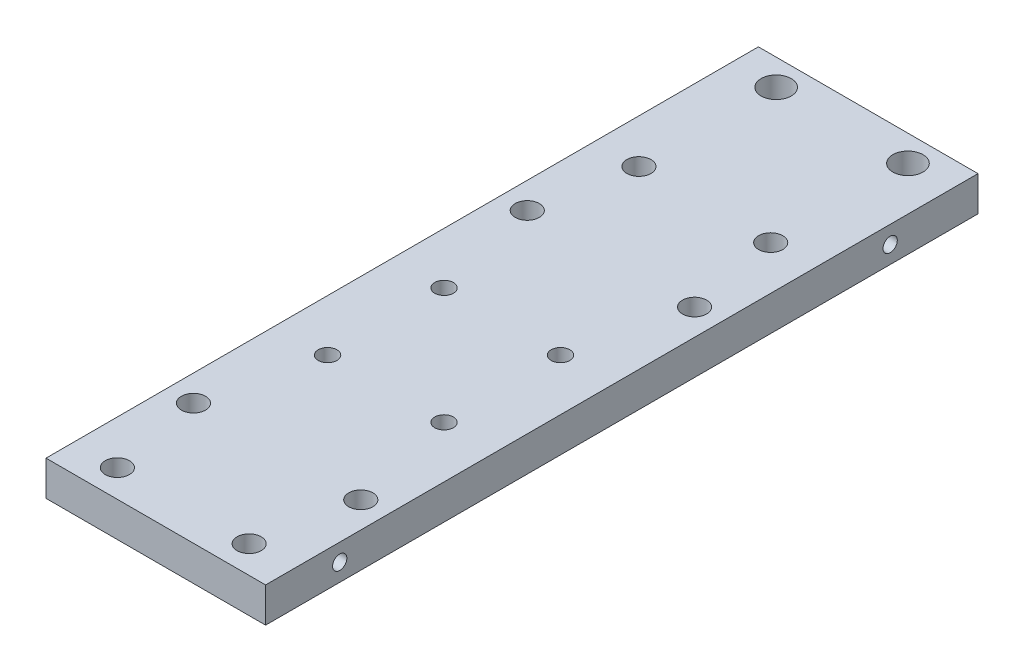
ISO-10303-21;
HEADER;
FILE_DESCRIPTION(('STEP AP214'),'2;1');
FILE_NAME('part.step','',(''),(''),'','','');
FILE_SCHEMA(('AUTOMOTIVE_DESIGN { 1 0 10303 214 1 1 1 1 }'));
ENDSEC;
DATA;
#1=APPLICATION_CONTEXT('core data for automotive mechanical design processes');
#2=APPLICATION_PROTOCOL_DEFINITION('international standard','automotive_design',2000,#1);
#3=PRODUCT_CONTEXT('',#1,'mechanical');
#4=PRODUCT('Part','Part','',(#3));
#5=PRODUCT_RELATED_PRODUCT_CATEGORY('part','',(#4));
#6=PRODUCT_DEFINITION_FORMATION('','',#4);
#7=PRODUCT_DEFINITION_CONTEXT('part definition',#1,'design');
#8=PRODUCT_DEFINITION('design','',#6,#7);
#9=PRODUCT_DEFINITION_SHAPE('','',#8);
#10=(LENGTH_UNIT() NAMED_UNIT(*) SI_UNIT(.MILLI.,.METRE.));
#11=(NAMED_UNIT(*) PLANE_ANGLE_UNIT() SI_UNIT($,.RADIAN.));
#12=(NAMED_UNIT(*) SI_UNIT($,.STERADIAN.) SOLID_ANGLE_UNIT());
#13=UNCERTAINTY_MEASURE_WITH_UNIT(LENGTH_MEASURE(1.E-05),#10,'distance_accuracy_value','');
#14=(GEOMETRIC_REPRESENTATION_CONTEXT(3) GLOBAL_UNCERTAINTY_ASSIGNED_CONTEXT((#13)) GLOBAL_UNIT_ASSIGNED_CONTEXT((#10,
#11,#12)) REPRESENTATION_CONTEXT('',''));
#15=CARTESIAN_POINT('',(0.,0.,0.));
#16=DIRECTION('',(0.,0.,1.));
#17=DIRECTION('',(1.,0.,0.));
#18=AXIS2_PLACEMENT_3D('',#15,#16,#17);
#19=CARTESIAN_POINT('',(20.,3.175,-80.));
#20=DIRECTION('',(-1.,0.,0.));
#21=DIRECTION('',(0.,0.,1.));
#22=AXIS2_PLACEMENT_3D('',#19,#20,#21);
#23=PLANE('',#22);
#24=CARTESIAN_POINT('',(20.,0.,36.2625));
#25=DIRECTION('',(-1.,0.,0.));
#26=DIRECTION('',(0.,0.,1.));
#27=AXIS2_PLACEMENT_3D('',#24,#25,#26);
#28=CIRCLE('',#27,1.3);
#29=CARTESIAN_POINT('',(20.,0.,37.5625));
#30=VERTEX_POINT('',#29);
#31=EDGE_CURVE('E260',#30,#30,#28,.T.);
#32=ORIENTED_EDGE('',*,*,#31,.T.);
#33=EDGE_LOOP('',(#32));
#34=FACE_BOUND('',#33,.T.);
#35=CARTESIAN_POINT('',(20.,0.,-64.));
#36=DIRECTION('',(-1.,0.,0.));
#37=DIRECTION('',(0.,0.,1.));
#38=AXIS2_PLACEMENT_3D('',#35,#36,#37);
#39=CIRCLE('',#38,1.29999999999999);
#40=CARTESIAN_POINT('',(20.,0.,-62.7));
#41=VERTEX_POINT('',#40);
#42=EDGE_CURVE('E263',#41,#41,#39,.T.);
#43=ORIENTED_EDGE('',*,*,#42,.T.);
#44=EDGE_LOOP('',(#43));
#45=FACE_BOUND('',#44,.T.);
#46=DIRECTION('',(0.,0.,-1.));
#47=VECTOR('',#46,1.);
#48=CARTESIAN_POINT('',(20.,3.175,-80.));
#49=LINE('',#48,#47);
#50=CARTESIAN_POINT('',(20.,3.175,49.7625));
#51=VERTEX_POINT('',#50);
#52=CARTESIAN_POINT('',(20.,3.175,-80.));
#53=VERTEX_POINT('',#52);
#54=EDGE_CURVE('E90',#51,#53,#49,.T.);
#55=ORIENTED_EDGE('',*,*,#54,.F.);
#56=DIRECTION('',(0.,1.,0.));
#57=VECTOR('',#56,1.);
#58=CARTESIAN_POINT('',(20.,-53.3178599727818,49.7625));
#59=LINE('',#58,#57);
#60=CARTESIAN_POINT('',(20.,-3.175,49.7625));
#61=VERTEX_POINT('',#60);
#62=EDGE_CURVE('E175',#61,#51,#59,.T.);
#63=ORIENTED_EDGE('',*,*,#62,.F.);
#64=DIRECTION('',(0.,0.,-1.));
#65=VECTOR('',#64,1.);
#66=CARTESIAN_POINT('',(20.,-3.175,-80.));
#67=LINE('',#66,#65);
#68=CARTESIAN_POINT('',(20.,-3.175,-80.));
#69=VERTEX_POINT('',#68);
#70=EDGE_CURVE('E81',#61,#69,#67,.T.);
#71=ORIENTED_EDGE('',*,*,#70,.T.);
#72=DIRECTION('',(0.,-1.,0.));
#73=VECTOR('',#72,1.);
#74=CARTESIAN_POINT('',(20.,3.175,-80.));
#75=LINE('',#74,#73);
#76=EDGE_CURVE('E11',#53,#69,#75,.T.);
#77=ORIENTED_EDGE('',*,*,#76,.F.);
#78=EDGE_LOOP('',(#55,#63,#71,#77));
#79=FACE_BOUND('',#78,.T.);
#80=ADVANCED_FACE('F35',(#34,#45,#79),#23,.F.);
#81=CARTESIAN_POINT('',(-20.,3.175,-80.));
#82=DIRECTION('',(0.,0.,1.));
#83=DIRECTION('',(1.,0.,0.));
#84=AXIS2_PLACEMENT_3D('',#81,#82,#83);
#85=PLANE('',#84);
#86=CARTESIAN_POINT('',(0.,0.,-80.));
#87=DIRECTION('',(0.,0.,-1.));
#88=DIRECTION('',(-1.,0.,0.));
#89=AXIS2_PLACEMENT_3D('',#86,#87,#88);
#90=CIRCLE('',#89,1.3);
#91=CARTESIAN_POINT('',(-1.3,0.,-80.));
#92=VERTEX_POINT('',#91);
#93=EDGE_CURVE('E128',#92,#92,#90,.T.);
#94=ORIENTED_EDGE('',*,*,#93,.F.);
#95=EDGE_LOOP('',(#94));
#96=FACE_BOUND('',#95,.T.);
#97=DIRECTION('',(-1.,0.,0.));
#98=VECTOR('',#97,1.);
#99=CARTESIAN_POINT('',(-20.,-3.175,-80.));
#100=LINE('',#99,#98);
#101=CARTESIAN_POINT('',(-20.,-3.175,-80.));
#102=VERTEX_POINT('',#101);
#103=EDGE_CURVE('E72',#69,#102,#100,.T.);
#104=ORIENTED_EDGE('',*,*,#103,.T.);
#105=DIRECTION('',(0.,-1.,0.));
#106=VECTOR('',#105,1.);
#107=CARTESIAN_POINT('',(-20.,3.175,-80.));
#108=LINE('',#107,#106);
#109=CARTESIAN_POINT('',(-20.,3.175,-80.));
#110=VERTEX_POINT('',#109);
#111=EDGE_CURVE('E43',#110,#102,#108,.T.);
#112=ORIENTED_EDGE('',*,*,#111,.F.);
#113=DIRECTION('',(-1.,0.,0.));
#114=VECTOR('',#113,1.);
#115=CARTESIAN_POINT('',(-20.,3.175,-80.));
#116=LINE('',#115,#114);
#117=EDGE_CURVE('E60',#53,#110,#116,.T.);
#118=ORIENTED_EDGE('',*,*,#117,.F.);
#119=ORIENTED_EDGE('',*,*,#76,.T.);
#120=EDGE_LOOP('',(#104,#112,#118,#119));
#121=FACE_BOUND('',#120,.T.);
#122=ADVANCED_FACE('F74',(#96,#121),#85,.F.);
#123=CARTESIAN_POINT('',(-20.,3.175,-80.));
#124=DIRECTION('',(1.,0.,0.));
#125=DIRECTION('',(0.,0.,-1.));
#126=AXIS2_PLACEMENT_3D('',#123,#124,#125);
#127=PLANE('',#126);
#128=CARTESIAN_POINT('',(-20.,0.,36.2625));
#129=DIRECTION('',(-1.,0.,0.));
#130=DIRECTION('',(0.,0.,1.));
#131=AXIS2_PLACEMENT_3D('',#128,#129,#130);
#132=CIRCLE('',#131,1.3);
#133=CARTESIAN_POINT('',(-20.,0.,37.5625));
#134=VERTEX_POINT('',#133);
#135=EDGE_CURVE('E189',#134,#134,#132,.T.);
#136=ORIENTED_EDGE('',*,*,#135,.F.);
#137=EDGE_LOOP('',(#136));
#138=FACE_BOUND('',#137,.T.);
#139=CARTESIAN_POINT('',(-20.,0.,-64.));
#140=DIRECTION('',(-1.,0.,0.));
#141=DIRECTION('',(0.,0.,1.));
#142=AXIS2_PLACEMENT_3D('',#139,#140,#141);
#143=CIRCLE('',#142,1.29999999999999);
#144=CARTESIAN_POINT('',(-20.,0.,-62.7));
#145=VERTEX_POINT('',#144);
#146=EDGE_CURVE('E275',#145,#145,#143,.T.);
#147=ORIENTED_EDGE('',*,*,#146,.F.);
#148=EDGE_LOOP('',(#147));
#149=FACE_BOUND('',#148,.T.);
#150=DIRECTION('',(0.,0.,1.));
#151=VECTOR('',#150,1.);
#152=CARTESIAN_POINT('',(-20.,-3.175,-80.));
#153=LINE('',#152,#151);
#154=CARTESIAN_POINT('',(-20.,-3.175,49.7625));
#155=VERTEX_POINT('',#154);
#156=EDGE_CURVE('E80',#102,#155,#153,.T.);
#157=ORIENTED_EDGE('',*,*,#156,.T.);
#158=DIRECTION('',(0.,1.,0.));
#159=VECTOR('',#158,1.);
#160=CARTESIAN_POINT('',(-20.,-53.3178599727818,49.7625));
#161=LINE('',#160,#159);
#162=CARTESIAN_POINT('',(-20.,3.175,49.7625));
#163=VERTEX_POINT('',#162);
#164=EDGE_CURVE('E51',#155,#163,#161,.T.);
#165=ORIENTED_EDGE('',*,*,#164,.T.);
#166=DIRECTION('',(0.,0.,1.));
#167=VECTOR('',#166,1.);
#168=CARTESIAN_POINT('',(-20.,3.175,-80.));
#169=LINE('',#168,#167);
#170=EDGE_CURVE('E86',#110,#163,#169,.T.);
#171=ORIENTED_EDGE('',*,*,#170,.F.);
#172=ORIENTED_EDGE('',*,*,#111,.T.);
#173=EDGE_LOOP('',(#157,#165,#171,#172));
#174=FACE_BOUND('',#173,.T.);
#175=ADVANCED_FACE('F85',(#138,#149,#174),#127,.F.);
#176=CARTESIAN_POINT('',(0.,3.175,0.));
#177=DIRECTION('',(0.,1.,0.));
#178=DIRECTION('',(0.,0.,1.));
#179=AXIS2_PLACEMENT_3D('',#176,#177,#178);
#180=PLANE('',#179);
#181=DIRECTION('',(-1.,0.,0.));
#182=VECTOR('',#181,1.);
#183=CARTESIAN_POINT('',(-20.,3.175,49.7625));
#184=LINE('',#183,#182);
#185=EDGE_CURVE('E182',#51,#163,#184,.T.);
#186=ORIENTED_EDGE('',*,*,#185,.F.);
#187=ORIENTED_EDGE('',*,*,#54,.T.);
#188=ORIENTED_EDGE('',*,*,#117,.T.);
#189=ORIENTED_EDGE('',*,*,#170,.T.);
#190=EDGE_LOOP('',(#186,#187,#188,#189));
#191=FACE_BOUND('',#190,.T.);
#192=CARTESIAN_POINT('',(-10.6066017177982,3.175,7.86910171779822));
#193=DIRECTION('',(0.,1.,0.));
#194=DIRECTION('',(0.,0.,1.));
#195=AXIS2_PLACEMENT_3D('',#192,#193,#194);
#196=CIRCLE('',#195,1.7);
#197=CARTESIAN_POINT('',(-10.6066017177982,3.175,9.56910171779823));
#198=VERTEX_POINT('',#197);
#199=EDGE_CURVE('E201',#198,#198,#196,.T.);
#200=ORIENTED_EDGE('',*,*,#199,.F.);
#201=EDGE_LOOP('',(#200));
#202=FACE_BOUND('',#201,.T.);
#203=CARTESIAN_POINT('',(10.6066017177982,3.175,7.86910171779818));
#204=DIRECTION('',(0.,1.,0.));
#205=DIRECTION('',(0.,0.,1.));
#206=AXIS2_PLACEMENT_3D('',#203,#204,#205);
#207=CIRCLE('',#206,1.7);
#208=CARTESIAN_POINT('',(10.6066017177982,3.175,9.56910171779818));
#209=VERTEX_POINT('',#208);
#210=EDGE_CURVE('E198',#209,#209,#207,.T.);
#211=ORIENTED_EDGE('',*,*,#210,.F.);
#212=EDGE_LOOP('',(#211));
#213=FACE_BOUND('',#212,.T.);
#214=CARTESIAN_POINT('',(10.6066017177982,3.175,-13.3441017177982));
#215=DIRECTION('',(0.,1.,0.));
#216=DIRECTION('',(0.,0.,1.));
#217=AXIS2_PLACEMENT_3D('',#214,#215,#216);
#218=CIRCLE('',#217,1.7);
#219=CARTESIAN_POINT('',(10.6066017177982,3.175,-11.6441017177982));
#220=VERTEX_POINT('',#219);
#221=EDGE_CURVE('E195',#220,#220,#218,.T.);
#222=ORIENTED_EDGE('',*,*,#221,.F.);
#223=EDGE_LOOP('',(#222));
#224=FACE_BOUND('',#223,.T.);
#225=CARTESIAN_POINT('',(-10.6066017177982,3.175,-13.3441017177982));
#226=DIRECTION('',(0.,1.,0.));
#227=DIRECTION('',(0.,0.,1.));
#228=AXIS2_PLACEMENT_3D('',#225,#226,#227);
#229=CIRCLE('',#228,1.7);
#230=CARTESIAN_POINT('',(-10.6066017177982,3.175,-11.6441017177982));
#231=VERTEX_POINT('',#230);
#232=EDGE_CURVE('E99',#231,#231,#229,.T.);
#233=ORIENTED_EDGE('',*,*,#232,.F.);
#234=EDGE_LOOP('',(#233));
#235=FACE_BOUND('',#234,.T.);
#236=CARTESIAN_POINT('',(-15.2375,3.175,-33.1375));
#237=DIRECTION('',(0.,1.,0.));
#238=DIRECTION('',(0.,0.,-1.));
#239=AXIS2_PLACEMENT_3D('',#236,#237,#238);
#240=CIRCLE('',#239,2.2);
#241=CARTESIAN_POINT('',(-15.2375,3.175,-35.3375));
#242=VERTEX_POINT('',#241);
#243=EDGE_CURVE('E106',#242,#242,#240,.T.);
#244=ORIENTED_EDGE('',*,*,#243,.F.);
#245=EDGE_LOOP('',(#244));
#246=FACE_BOUND('',#245,.T.);
#247=CARTESIAN_POINT('',(15.2375,3.175,-33.1375));
#248=DIRECTION('',(0.,1.,0.));
#249=DIRECTION('',(0.,0.,1.));
#250=AXIS2_PLACEMENT_3D('',#247,#248,#249);
#251=CIRCLE('',#250,2.2);
#252=CARTESIAN_POINT('',(15.2375,3.175,-30.9375));
#253=VERTEX_POINT('',#252);
#254=EDGE_CURVE('E115',#253,#253,#251,.T.);
#255=ORIENTED_EDGE('',*,*,#254,.F.);
#256=EDGE_LOOP('',(#255));
#257=FACE_BOUND('',#256,.T.);
#258=CARTESIAN_POINT('',(15.2375,3.175,27.6625));
#259=DIRECTION('',(0.,1.,0.));
#260=DIRECTION('',(0.,0.,-1.));
#261=AXIS2_PLACEMENT_3D('',#258,#259,#260);
#262=CIRCLE('',#261,2.2);
#263=CARTESIAN_POINT('',(15.2375,3.175,25.4625));
#264=VERTEX_POINT('',#263);
#265=EDGE_CURVE('E206',#264,#264,#262,.T.);
#266=ORIENTED_EDGE('',*,*,#265,.F.);
#267=EDGE_LOOP('',(#266));
#268=FACE_BOUND('',#267,.T.);
#269=CARTESIAN_POINT('',(-15.2375,3.175,27.6625));
#270=DIRECTION('',(0.,1.,0.));
#271=DIRECTION('',(0.,0.,1.));
#272=AXIS2_PLACEMENT_3D('',#269,#270,#271);
#273=CIRCLE('',#272,2.2);
#274=CARTESIAN_POINT('',(-15.2375,3.175,29.8625));
#275=VERTEX_POINT('',#274);
#276=EDGE_CURVE('E121',#275,#275,#273,.T.);
#277=ORIENTED_EDGE('',*,*,#276,.F.);
#278=EDGE_LOOP('',(#277));
#279=FACE_BOUND('',#278,.T.);
#280=CARTESIAN_POINT('',(12.0000000000023,3.175,44.7625));
#281=DIRECTION('',(0.,1.,0.));
#282=DIRECTION('',(0.,0.,1.));
#283=AXIS2_PLACEMENT_3D('',#280,#281,#282);
#284=CIRCLE('',#283,2.2);
#285=CARTESIAN_POINT('',(12.0000000000023,3.175,46.9625));
#286=VERTEX_POINT('',#285);
#287=EDGE_CURVE('E167',#286,#286,#284,.F.);
#288=ORIENTED_EDGE('',*,*,#287,.T.);
#289=EDGE_LOOP('',(#288));
#290=FACE_BOUND('',#289,.T.);
#291=CARTESIAN_POINT('',(-12.,3.175,-75.2375));
#292=DIRECTION('',(0.,1.,0.));
#293=DIRECTION('',(0.,0.,1.));
#294=AXIS2_PLACEMENT_3D('',#291,#292,#293);
#295=CIRCLE('',#294,2.75);
#296=CARTESIAN_POINT('',(-12.,3.175,-72.4875));
#297=VERTEX_POINT('',#296);
#298=EDGE_CURVE('E164',#297,#297,#295,.F.);
#299=ORIENTED_EDGE('',*,*,#298,.T.);
#300=EDGE_LOOP('',(#299));
#301=FACE_BOUND('',#300,.T.);
#302=CARTESIAN_POINT('',(12.,3.175,-75.2375));
#303=DIRECTION('',(0.,1.,0.));
#304=DIRECTION('',(0.,0.,1.));
#305=AXIS2_PLACEMENT_3D('',#302,#303,#304);
#306=CIRCLE('',#305,2.75);
#307=CARTESIAN_POINT('',(12.,3.175,-72.4875));
#308=VERTEX_POINT('',#307);
#309=EDGE_CURVE('E161',#308,#308,#306,.F.);
#310=ORIENTED_EDGE('',*,*,#309,.T.);
#311=EDGE_LOOP('',(#310));
#312=FACE_BOUND('',#311,.T.);
#313=CARTESIAN_POINT('',(-12.,3.175,-50.2375));
#314=DIRECTION('',(0.,1.,0.));
#315=DIRECTION('',(0.,0.,1.));
#316=AXIS2_PLACEMENT_3D('',#313,#314,#315);
#317=CIRCLE('',#316,2.2);
#318=CARTESIAN_POINT('',(-12.,3.175,-48.0375));
#319=VERTEX_POINT('',#318);
#320=EDGE_CURVE('E158',#319,#319,#317,.F.);
#321=ORIENTED_EDGE('',*,*,#320,.T.);
#322=EDGE_LOOP('',(#321));
#323=FACE_BOUND('',#322,.T.);
#324=CARTESIAN_POINT('',(-11.9999999999977,3.175,44.7625));
#325=DIRECTION('',(0.,1.,0.));
#326=DIRECTION('',(0.,0.,1.));
#327=AXIS2_PLACEMENT_3D('',#324,#325,#326);
#328=CIRCLE('',#327,2.2);
#329=CARTESIAN_POINT('',(-11.9999999999977,3.175,46.9625));
#330=VERTEX_POINT('',#329);
#331=EDGE_CURVE('E155',#330,#330,#328,.F.);
#332=ORIENTED_EDGE('',*,*,#331,.T.);
#333=EDGE_LOOP('',(#332));
#334=FACE_BOUND('',#333,.T.);
#335=CARTESIAN_POINT('',(12.,3.175,-50.2375));
#336=DIRECTION('',(0.,1.,0.));
#337=DIRECTION('',(0.,0.,1.));
#338=AXIS2_PLACEMENT_3D('',#335,#336,#337);
#339=CIRCLE('',#338,2.2);
#340=CARTESIAN_POINT('',(12.,3.175,-48.0375));
#341=VERTEX_POINT('',#340);
#342=EDGE_CURVE('E152',#341,#341,#339,.F.);
#343=ORIENTED_EDGE('',*,*,#342,.T.);
#344=EDGE_LOOP('',(#343));
#345=FACE_BOUND('',#344,.T.);
#346=ADVANCED_FACE('F184',(#191,#202,#213,#224,#235,#246,#257,#268,#279,#290,#301,#312,#323,
#334,#345),#180,.T.);
#347=CARTESIAN_POINT('',(0.,-3.175,0.));
#348=DIRECTION('',(0.,1.,0.));
#349=DIRECTION('',(0.,0.,1.));
#350=AXIS2_PLACEMENT_3D('',#347,#348,#349);
#351=PLANE('',#350);
#352=CARTESIAN_POINT('',(-10.6066017177982,-3.175,7.86910171779822));
#353=DIRECTION('',(0.,1.,0.));
#354=DIRECTION('',(0.,0.,1.));
#355=AXIS2_PLACEMENT_3D('',#352,#353,#354);
#356=CIRCLE('',#355,1.7);
#357=CARTESIAN_POINT('',(-10.6066017177982,-3.175,9.56910171779823));
#358=VERTEX_POINT('',#357);
#359=EDGE_CURVE('E38',#358,#358,#356,.T.);
#360=ORIENTED_EDGE('',*,*,#359,.T.);
#361=EDGE_LOOP('',(#360));
#362=FACE_BOUND('',#361,.T.);
#363=CARTESIAN_POINT('',(10.6066017177982,-3.175,7.86910171779818));
#364=DIRECTION('',(0.,1.,0.));
#365=DIRECTION('',(0.,0.,1.));
#366=AXIS2_PLACEMENT_3D('',#363,#364,#365);
#367=CIRCLE('',#366,1.7);
#368=CARTESIAN_POINT('',(10.6066017177982,-3.175,9.56910171779818));
#369=VERTEX_POINT('',#368);
#370=EDGE_CURVE('E101',#369,#369,#367,.T.);
#371=ORIENTED_EDGE('',*,*,#370,.T.);
#372=EDGE_LOOP('',(#371));
#373=FACE_BOUND('',#372,.T.);
#374=CARTESIAN_POINT('',(10.6066017177982,-3.175,-13.3441017177982));
#375=DIRECTION('',(0.,1.,0.));
#376=DIRECTION('',(0.,0.,1.));
#377=AXIS2_PLACEMENT_3D('',#374,#375,#376);
#378=CIRCLE('',#377,1.7);
#379=CARTESIAN_POINT('',(10.6066017177982,-3.175,-11.6441017177982));
#380=VERTEX_POINT('',#379);
#381=EDGE_CURVE('E98',#380,#380,#378,.T.);
#382=ORIENTED_EDGE('',*,*,#381,.T.);
#383=EDGE_LOOP('',(#382));
#384=FACE_BOUND('',#383,.T.);
#385=CARTESIAN_POINT('',(-10.6066017177982,-3.175,-13.3441017177982));
#386=DIRECTION('',(0.,1.,0.));
#387=DIRECTION('',(0.,0.,1.));
#388=AXIS2_PLACEMENT_3D('',#385,#386,#387);
#389=CIRCLE('',#388,1.7);
#390=CARTESIAN_POINT('',(-10.6066017177982,-3.175,-11.6441017177982));
#391=VERTEX_POINT('',#390);
#392=EDGE_CURVE('E95',#391,#391,#389,.T.);
#393=ORIENTED_EDGE('',*,*,#392,.T.);
#394=EDGE_LOOP('',(#393));
#395=FACE_BOUND('',#394,.T.);
#396=CARTESIAN_POINT('',(-15.2375,-3.175,-33.1375));
#397=DIRECTION('',(0.,1.,0.));
#398=DIRECTION('',(0.,0.,1.));
#399=AXIS2_PLACEMENT_3D('',#396,#397,#398);
#400=CIRCLE('',#399,2.2);
#401=CARTESIAN_POINT('',(-15.2375,-3.175,-30.9375));
#402=VERTEX_POINT('',#401);
#403=EDGE_CURVE('E110',#402,#402,#400,.F.);
#404=ORIENTED_EDGE('',*,*,#403,.F.);
#405=EDGE_LOOP('',(#404));
#406=FACE_BOUND('',#405,.T.);
#407=CARTESIAN_POINT('',(15.2375,-3.175,-33.1375));
#408=DIRECTION('',(0.,1.,0.));
#409=DIRECTION('',(0.,0.,1.));
#410=AXIS2_PLACEMENT_3D('',#407,#408,#409);
#411=CIRCLE('',#410,2.2);
#412=CARTESIAN_POINT('',(15.2375,-3.175,-30.9375));
#413=VERTEX_POINT('',#412);
#414=EDGE_CURVE('E118',#413,#413,#411,.F.);
#415=ORIENTED_EDGE('',*,*,#414,.F.);
#416=EDGE_LOOP('',(#415));
#417=FACE_BOUND('',#416,.T.);
#418=CARTESIAN_POINT('',(15.2375,-3.175,27.6625));
#419=DIRECTION('',(0.,1.,0.));
#420=DIRECTION('',(0.,0.,1.));
#421=AXIS2_PLACEMENT_3D('',#418,#419,#420);
#422=CIRCLE('',#421,2.2);
#423=CARTESIAN_POINT('',(15.2375,-3.175,29.8625));
#424=VERTEX_POINT('',#423);
#425=EDGE_CURVE('E125',#424,#424,#422,.F.);
#426=ORIENTED_EDGE('',*,*,#425,.F.);
#427=EDGE_LOOP('',(#426));
#428=FACE_BOUND('',#427,.T.);
#429=CARTESIAN_POINT('',(-15.2375,-3.175,27.6625));
#430=DIRECTION('',(0.,1.,0.));
#431=DIRECTION('',(0.,0.,1.));
#432=AXIS2_PLACEMENT_3D('',#429,#430,#431);
#433=CIRCLE('',#432,2.2);
#434=CARTESIAN_POINT('',(-15.2375,-3.175,29.8625));
#435=VERTEX_POINT('',#434);
#436=EDGE_CURVE('E124',#435,#435,#433,.F.);
#437=ORIENTED_EDGE('',*,*,#436,.F.);
#438=EDGE_LOOP('',(#437));
#439=FACE_BOUND('',#438,.T.);
#440=CARTESIAN_POINT('',(12.0000000000023,-3.175,44.7625));
#441=DIRECTION('',(0.,1.,0.));
#442=DIRECTION('',(0.,0.,1.));
#443=AXIS2_PLACEMENT_3D('',#440,#441,#442);
#444=CIRCLE('',#443,2.2);
#445=CARTESIAN_POINT('',(12.0000000000023,-3.175,46.9625));
#446=VERTEX_POINT('',#445);
#447=EDGE_CURVE('E137',#446,#446,#444,.F.);
#448=ORIENTED_EDGE('',*,*,#447,.F.);
#449=EDGE_LOOP('',(#448));
#450=FACE_BOUND('',#449,.T.);
#451=CARTESIAN_POINT('',(-12.,-3.175,-75.2375));
#452=DIRECTION('',(0.,1.,0.));
#453=DIRECTION('',(0.,0.,1.));
#454=AXIS2_PLACEMENT_3D('',#451,#452,#453);
#455=CIRCLE('',#454,2.75);
#456=CARTESIAN_POINT('',(-12.,-3.175,-72.4875));
#457=VERTEX_POINT('',#456);
#458=EDGE_CURVE('E138',#457,#457,#455,.F.);
#459=ORIENTED_EDGE('',*,*,#458,.F.);
#460=EDGE_LOOP('',(#459));
#461=FACE_BOUND('',#460,.T.);
#462=CARTESIAN_POINT('',(12.,-3.175,-75.2375));
#463=DIRECTION('',(0.,1.,0.));
#464=DIRECTION('',(0.,0.,1.));
#465=AXIS2_PLACEMENT_3D('',#462,#463,#464);
#466=CIRCLE('',#465,2.75);
#467=CARTESIAN_POINT('',(12.,-3.175,-72.4875));
#468=VERTEX_POINT('',#467);
#469=EDGE_CURVE('E141',#468,#468,#466,.F.);
#470=ORIENTED_EDGE('',*,*,#469,.F.);
#471=EDGE_LOOP('',(#470));
#472=FACE_BOUND('',#471,.T.);
#473=CARTESIAN_POINT('',(-12.,-3.175,-50.2375));
#474=DIRECTION('',(0.,1.,0.));
#475=DIRECTION('',(0.,0.,1.));
#476=AXIS2_PLACEMENT_3D('',#473,#474,#475);
#477=CIRCLE('',#476,2.2);
#478=CARTESIAN_POINT('',(-12.,-3.175,-48.0375));
#479=VERTEX_POINT('',#478);
#480=EDGE_CURVE('E144',#479,#479,#477,.F.);
#481=ORIENTED_EDGE('',*,*,#480,.F.);
#482=EDGE_LOOP('',(#481));
#483=FACE_BOUND('',#482,.T.);
#484=CARTESIAN_POINT('',(-11.9999999999977,-3.175,44.7625));
#485=DIRECTION('',(0.,1.,0.));
#486=DIRECTION('',(0.,0.,1.));
#487=AXIS2_PLACEMENT_3D('',#484,#485,#486);
#488=CIRCLE('',#487,2.2);
#489=CARTESIAN_POINT('',(-11.9999999999977,-3.175,46.9625));
#490=VERTEX_POINT('',#489);
#491=EDGE_CURVE('E132',#490,#490,#488,.F.);
#492=ORIENTED_EDGE('',*,*,#491,.F.);
#493=EDGE_LOOP('',(#492));
#494=FACE_BOUND('',#493,.T.);
#495=CARTESIAN_POINT('',(12.,-3.175,-50.2375));
#496=DIRECTION('',(0.,1.,0.));
#497=DIRECTION('',(0.,0.,1.));
#498=AXIS2_PLACEMENT_3D('',#495,#496,#497);
#499=CIRCLE('',#498,2.2);
#500=CARTESIAN_POINT('',(12.,-3.175,-48.0375));
#501=VERTEX_POINT('',#500);
#502=EDGE_CURVE('E147',#501,#501,#499,.F.);
#503=ORIENTED_EDGE('',*,*,#502,.F.);
#504=EDGE_LOOP('',(#503));
#505=FACE_BOUND('',#504,.T.);
#506=ORIENTED_EDGE('',*,*,#70,.F.);
#507=DIRECTION('',(1.,0.,0.));
#508=VECTOR('',#507,1.);
#509=CARTESIAN_POINT('',(-20.,-3.175,49.7625));
#510=LINE('',#509,#508);
#511=EDGE_CURVE('E89',#155,#61,#510,.T.);
#512=ORIENTED_EDGE('',*,*,#511,.F.);
#513=ORIENTED_EDGE('',*,*,#156,.F.);
#514=ORIENTED_EDGE('',*,*,#103,.F.);
#515=EDGE_LOOP('',(#506,#512,#513,#514));
#516=FACE_BOUND('',#515,.T.);
#517=ADVANCED_FACE('F88',(#362,#373,#384,#395,#406,#417,#428,#439,#450,#461,#472,#483,#494,#505,
#516),#351,.F.);
#518=CARTESIAN_POINT('',(12.,6.35,-50.2375));
#519=DIRECTION('',(0.,-1.,0.));
#520=DIRECTION('',(0.,0.,-1.));
#521=AXIS2_PLACEMENT_3D('',#518,#519,#520);
#522=CYLINDRICAL_SURFACE('',#521,2.2);
#523=ORIENTED_EDGE('',*,*,#342,.F.);
#524=EDGE_LOOP('',(#523));
#525=FACE_BOUND('',#524,.T.);
#526=ORIENTED_EDGE('',*,*,#502,.T.);
#527=EDGE_LOOP('',(#526));
#528=FACE_BOUND('',#527,.T.);
#529=ADVANCED_FACE('F220',(#525,#528),#522,.F.);
#530=CARTESIAN_POINT('',(-11.9999999999977,6.35,44.7625));
#531=DIRECTION('',(0.,-1.,0.));
#532=DIRECTION('',(0.,0.,-1.));
#533=AXIS2_PLACEMENT_3D('',#530,#531,#532);
#534=CYLINDRICAL_SURFACE('',#533,2.2);
#535=ORIENTED_EDGE('',*,*,#331,.F.);
#536=EDGE_LOOP('',(#535));
#537=FACE_BOUND('',#536,.T.);
#538=ORIENTED_EDGE('',*,*,#491,.T.);
#539=EDGE_LOOP('',(#538));
#540=FACE_BOUND('',#539,.T.);
#541=ADVANCED_FACE('F239',(#537,#540),#534,.F.);
#542=CARTESIAN_POINT('',(-12.,6.35,-50.2375));
#543=DIRECTION('',(0.,-1.,0.));
#544=DIRECTION('',(0.,0.,-1.));
#545=AXIS2_PLACEMENT_3D('',#542,#543,#544);
#546=CYLINDRICAL_SURFACE('',#545,2.2);
#547=ORIENTED_EDGE('',*,*,#320,.F.);
#548=EDGE_LOOP('',(#547));
#549=FACE_BOUND('',#548,.T.);
#550=ORIENTED_EDGE('',*,*,#480,.T.);
#551=EDGE_LOOP('',(#550));
#552=FACE_BOUND('',#551,.T.);
#553=ADVANCED_FACE('F245',(#549,#552),#546,.F.);
#554=CARTESIAN_POINT('',(12.,6.35,-75.2375));
#555=DIRECTION('',(0.,-1.,0.));
#556=DIRECTION('',(0.,0.,-1.));
#557=AXIS2_PLACEMENT_3D('',#554,#555,#556);
#558=CYLINDRICAL_SURFACE('',#557,2.75);
#559=ORIENTED_EDGE('',*,*,#309,.F.);
#560=EDGE_LOOP('',(#559));
#561=FACE_BOUND('',#560,.T.);
#562=ORIENTED_EDGE('',*,*,#469,.T.);
#563=EDGE_LOOP('',(#562));
#564=FACE_BOUND('',#563,.T.);
#565=ADVANCED_FACE('F363',(#561,#564),#558,.F.);
#566=CARTESIAN_POINT('',(-12.,6.35,-75.2375));
#567=DIRECTION('',(0.,-1.,0.));
#568=DIRECTION('',(0.,0.,-1.));
#569=AXIS2_PLACEMENT_3D('',#566,#567,#568);
#570=CYLINDRICAL_SURFACE('',#569,2.75);
#571=ORIENTED_EDGE('',*,*,#298,.F.);
#572=EDGE_LOOP('',(#571));
#573=FACE_BOUND('',#572,.T.);
#574=ORIENTED_EDGE('',*,*,#458,.T.);
#575=EDGE_LOOP('',(#574));
#576=FACE_BOUND('',#575,.T.);
#577=ADVANCED_FACE('F360',(#573,#576),#570,.F.);
#578=CARTESIAN_POINT('',(12.0000000000023,6.35,44.7625));
#579=DIRECTION('',(0.,-1.,0.));
#580=DIRECTION('',(0.,0.,-1.));
#581=AXIS2_PLACEMENT_3D('',#578,#579,#580);
#582=CYLINDRICAL_SURFACE('',#581,2.2);
#583=ORIENTED_EDGE('',*,*,#287,.F.);
#584=EDGE_LOOP('',(#583));
#585=FACE_BOUND('',#584,.T.);
#586=ORIENTED_EDGE('',*,*,#447,.T.);
#587=EDGE_LOOP('',(#586));
#588=FACE_BOUND('',#587,.T.);
#589=ADVANCED_FACE('F357',(#585,#588),#582,.F.);
#590=CARTESIAN_POINT('',(0.,0.,-72.));
#591=DIRECTION('',(0.,0.,-1.));
#592=DIRECTION('',(-1.,0.,0.));
#593=AXIS2_PLACEMENT_3D('',#590,#591,#592);
#594=CYLINDRICAL_SURFACE('',#593,1.3);
#595=CARTESIAN_POINT('',(0.,0.,-72.));
#596=DIRECTION('',(0.,0.,-1.));
#597=DIRECTION('',(-1.,0.,0.));
#598=AXIS2_PLACEMENT_3D('',#595,#596,#597);
#599=CIRCLE('',#598,1.3);
#600=CARTESIAN_POINT('',(-1.3,0.,-72.));
#601=VERTEX_POINT('',#600);
#602=EDGE_CURVE('E129',#601,#601,#599,.T.);
#603=ORIENTED_EDGE('',*,*,#602,.F.);
#604=EDGE_LOOP('',(#603));
#605=FACE_BOUND('',#604,.T.);
#606=ORIENTED_EDGE('',*,*,#93,.T.);
#607=EDGE_LOOP('',(#606));
#608=FACE_BOUND('',#607,.T.);
#609=ADVANCED_FACE('F354',(#605,#608),#594,.F.);
#610=CARTESIAN_POINT('',(0.,0.,-72.));
#611=DIRECTION('',(0.,0.,-1.));
#612=DIRECTION('',(-1.,0.,0.));
#613=AXIS2_PLACEMENT_3D('',#610,#611,#612);
#614=PLANE('',#613);
#615=ORIENTED_EDGE('',*,*,#602,.T.);
#616=EDGE_LOOP('',(#615));
#617=FACE_BOUND('',#616,.T.);
#618=ADVANCED_FACE('F350',(#617),#614,.T.);
#619=CARTESIAN_POINT('',(-15.2375,-9.39753967444162,27.6625));
#620=DIRECTION('',(0.,1.,0.));
#621=DIRECTION('',(0.,0.,1.));
#622=AXIS2_PLACEMENT_3D('',#619,#620,#621);
#623=CYLINDRICAL_SURFACE('',#622,2.2);
#624=ORIENTED_EDGE('',*,*,#436,.T.);
#625=EDGE_LOOP('',(#624));
#626=FACE_BOUND('',#625,.T.);
#627=ORIENTED_EDGE('',*,*,#276,.T.);
#628=EDGE_LOOP('',(#627));
#629=FACE_BOUND('',#628,.T.);
#630=ADVANCED_FACE('F341',(#626,#629),#623,.F.);
#631=CARTESIAN_POINT('',(15.2375,-9.39753967444162,27.6625));
#632=DIRECTION('',(0.,1.,0.));
#633=DIRECTION('',(0.,0.,1.));
#634=AXIS2_PLACEMENT_3D('',#631,#632,#633);
#635=CYLINDRICAL_SURFACE('',#634,2.2);
#636=ORIENTED_EDGE('',*,*,#425,.T.);
#637=EDGE_LOOP('',(#636));
#638=FACE_BOUND('',#637,.T.);
#639=ORIENTED_EDGE('',*,*,#265,.T.);
#640=EDGE_LOOP('',(#639));
#641=FACE_BOUND('',#640,.T.);
#642=ADVANCED_FACE('F338',(#638,#641),#635,.F.);
#643=CARTESIAN_POINT('',(15.2375,-9.39753967444162,-33.1375));
#644=DIRECTION('',(0.,1.,0.));
#645=DIRECTION('',(0.,0.,1.));
#646=AXIS2_PLACEMENT_3D('',#643,#644,#645);
#647=CYLINDRICAL_SURFACE('',#646,2.2);
#648=ORIENTED_EDGE('',*,*,#414,.T.);
#649=EDGE_LOOP('',(#648));
#650=FACE_BOUND('',#649,.T.);
#651=ORIENTED_EDGE('',*,*,#254,.T.);
#652=EDGE_LOOP('',(#651));
#653=FACE_BOUND('',#652,.T.);
#654=ADVANCED_FACE('F216',(#650,#653),#647,.F.);
#655=CARTESIAN_POINT('',(-15.2375,-9.39753967444162,-33.1375));
#656=DIRECTION('',(0.,1.,0.));
#657=DIRECTION('',(0.,0.,1.));
#658=AXIS2_PLACEMENT_3D('',#655,#656,#657);
#659=CYLINDRICAL_SURFACE('',#658,2.2);
#660=ORIENTED_EDGE('',*,*,#403,.T.);
#661=EDGE_LOOP('',(#660));
#662=FACE_BOUND('',#661,.T.);
#663=ORIENTED_EDGE('',*,*,#243,.T.);
#664=EDGE_LOOP('',(#663));
#665=FACE_BOUND('',#664,.T.);
#666=ADVANCED_FACE('F336',(#662,#665),#659,.F.);
#667=CARTESIAN_POINT('',(-10.6066017177982,-10.,-13.3441017177982));
#668=DIRECTION('',(0.,1.,0.));
#669=DIRECTION('',(0.,0.,1.));
#670=AXIS2_PLACEMENT_3D('',#667,#668,#669);
#671=CYLINDRICAL_SURFACE('',#670,1.7);
#672=ORIENTED_EDGE('',*,*,#232,.T.);
#673=EDGE_LOOP('',(#672));
#674=FACE_BOUND('',#673,.T.);
#675=ORIENTED_EDGE('',*,*,#392,.F.);
#676=EDGE_LOOP('',(#675));
#677=FACE_BOUND('',#676,.T.);
#678=ADVANCED_FACE('F326',(#674,#677),#671,.F.);
#679=CARTESIAN_POINT('',(10.6066017177982,-10.,-13.3441017177982));
#680=DIRECTION('',(0.,1.,0.));
#681=DIRECTION('',(0.,0.,1.));
#682=AXIS2_PLACEMENT_3D('',#679,#680,#681);
#683=CYLINDRICAL_SURFACE('',#682,1.7);
#684=ORIENTED_EDGE('',*,*,#221,.T.);
#685=EDGE_LOOP('',(#684));
#686=FACE_BOUND('',#685,.T.);
#687=ORIENTED_EDGE('',*,*,#381,.F.);
#688=EDGE_LOOP('',(#687));
#689=FACE_BOUND('',#688,.T.);
#690=ADVANCED_FACE('F322',(#686,#689),#683,.F.);
#691=CARTESIAN_POINT('',(10.6066017177982,-10.,7.86910171779818));
#692=DIRECTION('',(0.,1.,0.));
#693=DIRECTION('',(0.,0.,1.));
#694=AXIS2_PLACEMENT_3D('',#691,#692,#693);
#695=CYLINDRICAL_SURFACE('',#694,1.7);
#696=ORIENTED_EDGE('',*,*,#210,.T.);
#697=EDGE_LOOP('',(#696));
#698=FACE_BOUND('',#697,.T.);
#699=ORIENTED_EDGE('',*,*,#370,.F.);
#700=EDGE_LOOP('',(#699));
#701=FACE_BOUND('',#700,.T.);
#702=ADVANCED_FACE('F325',(#698,#701),#695,.F.);
#703=CARTESIAN_POINT('',(-10.6066017177982,-10.,7.86910171779822));
#704=DIRECTION('',(0.,1.,0.));
#705=DIRECTION('',(0.,0.,1.));
#706=AXIS2_PLACEMENT_3D('',#703,#704,#705);
#707=CYLINDRICAL_SURFACE('',#706,1.7);
#708=ORIENTED_EDGE('',*,*,#199,.T.);
#709=EDGE_LOOP('',(#708));
#710=FACE_BOUND('',#709,.T.);
#711=ORIENTED_EDGE('',*,*,#359,.F.);
#712=EDGE_LOOP('',(#711));
#713=FACE_BOUND('',#712,.T.);
#714=ADVANCED_FACE('F321',(#710,#713),#707,.F.);
#715=CARTESIAN_POINT('',(-20.,-53.3178599727818,49.7625));
#716=DIRECTION('',(0.,0.,-1.));
#717=DIRECTION('',(-1.,0.,0.));
#718=AXIS2_PLACEMENT_3D('',#715,#716,#717);
#719=PLANE('',#718);
#720=ORIENTED_EDGE('',*,*,#511,.T.);
#721=ORIENTED_EDGE('',*,*,#62,.T.);
#722=ORIENTED_EDGE('',*,*,#185,.T.);
#723=ORIENTED_EDGE('',*,*,#164,.F.);
#724=EDGE_LOOP('',(#720,#721,#722,#723));
#725=FACE_BOUND('',#724,.T.);
#726=ADVANCED_FACE('F181',(#725),#719,.F.);
#727=CARTESIAN_POINT('',(-12.,0.,-64.));
#728=DIRECTION('',(-1.,0.,0.));
#729=DIRECTION('',(0.,0.,1.));
#730=AXIS2_PLACEMENT_3D('',#727,#728,#729);
#731=CYLINDRICAL_SURFACE('',#730,1.29999999999999);
#732=CARTESIAN_POINT('',(-12.,0.,-64.));
#733=DIRECTION('',(-1.,0.,0.));
#734=DIRECTION('',(0.,0.,1.));
#735=AXIS2_PLACEMENT_3D('',#732,#733,#734);
#736=CIRCLE('',#735,1.29999999999999);
#737=CARTESIAN_POINT('',(-12.,0.,-62.7));
#738=VERTEX_POINT('',#737);
#739=EDGE_CURVE('E273',#738,#738,#736,.T.);
#740=ORIENTED_EDGE('',*,*,#739,.F.);
#741=EDGE_LOOP('',(#740));
#742=FACE_BOUND('',#741,.T.);
#743=ORIENTED_EDGE('',*,*,#146,.T.);
#744=EDGE_LOOP('',(#743));
#745=FACE_BOUND('',#744,.T.);
#746=ADVANCED_FACE('F314',(#742,#745),#731,.F.);
#747=CARTESIAN_POINT('',(-12.,0.,-64.));
#748=DIRECTION('',(-1.,0.,0.));
#749=DIRECTION('',(0.,0.,1.));
#750=AXIS2_PLACEMENT_3D('',#747,#748,#749);
#751=PLANE('',#750);
#752=ORIENTED_EDGE('',*,*,#739,.T.);
#753=EDGE_LOOP('',(#752));
#754=FACE_BOUND('',#753,.T.);
#755=ADVANCED_FACE('F310',(#754),#751,.T.);
#756=CARTESIAN_POINT('',(-12.,0.,36.2625));
#757=DIRECTION('',(-1.,0.,0.));
#758=DIRECTION('',(0.,0.,1.));
#759=AXIS2_PLACEMENT_3D('',#756,#757,#758);
#760=CYLINDRICAL_SURFACE('',#759,1.3);
#761=CARTESIAN_POINT('',(-12.,0.,36.2625));
#762=DIRECTION('',(-1.,0.,0.));
#763=DIRECTION('',(0.,0.,1.));
#764=AXIS2_PLACEMENT_3D('',#761,#762,#763);
#765=CIRCLE('',#764,1.3);
#766=CARTESIAN_POINT('',(-12.,0.,37.5625));
#767=VERTEX_POINT('',#766);
#768=EDGE_CURVE('E186',#767,#767,#765,.T.);
#769=ORIENTED_EDGE('',*,*,#768,.F.);
#770=EDGE_LOOP('',(#769));
#771=FACE_BOUND('',#770,.T.);
#772=ORIENTED_EDGE('',*,*,#135,.T.);
#773=EDGE_LOOP('',(#772));
#774=FACE_BOUND('',#773,.T.);
#775=ADVANCED_FACE('F306',(#771,#774),#760,.F.);
#776=CARTESIAN_POINT('',(-12.,0.,36.2625));
#777=DIRECTION('',(-1.,0.,0.));
#778=DIRECTION('',(0.,0.,1.));
#779=AXIS2_PLACEMENT_3D('',#776,#777,#778);
#780=PLANE('',#779);
#781=ORIENTED_EDGE('',*,*,#768,.T.);
#782=EDGE_LOOP('',(#781));
#783=FACE_BOUND('',#782,.T.);
#784=ADVANCED_FACE('F302',(#783),#780,.T.);
#785=CARTESIAN_POINT('',(12.,0.,-64.));
#786=DIRECTION('',(1.,0.,0.));
#787=DIRECTION('',(0.,0.,-1.));
#788=AXIS2_PLACEMENT_3D('',#785,#786,#787);
#789=CYLINDRICAL_SURFACE('',#788,1.29999999999999);
#790=CARTESIAN_POINT('',(12.,0.,-64.));
#791=DIRECTION('',(-1.,0.,0.));
#792=DIRECTION('',(0.,0.,1.));
#793=AXIS2_PLACEMENT_3D('',#790,#791,#792);
#794=CIRCLE('',#793,1.29999999999999);
#795=CARTESIAN_POINT('',(12.,0.,-62.7));
#796=VERTEX_POINT('',#795);
#797=EDGE_CURVE('E265',#796,#796,#794,.T.);
#798=ORIENTED_EDGE('',*,*,#797,.T.);
#799=EDGE_LOOP('',(#798));
#800=FACE_BOUND('',#799,.T.);
#801=ORIENTED_EDGE('',*,*,#42,.F.);
#802=EDGE_LOOP('',(#801));
#803=FACE_BOUND('',#802,.T.);
#804=ADVANCED_FACE('F298',(#800,#803),#789,.F.);
#805=CARTESIAN_POINT('',(12.,0.,-64.));
#806=DIRECTION('',(1.,0.,0.));
#807=DIRECTION('',(0.,0.,1.));
#808=AXIS2_PLACEMENT_3D('',#805,#806,#807);
#809=PLANE('',#808);
#810=ORIENTED_EDGE('',*,*,#797,.F.);
#811=EDGE_LOOP('',(#810));
#812=FACE_BOUND('',#811,.T.);
#813=ADVANCED_FACE('F293',(#812),#809,.T.);
#814=CARTESIAN_POINT('',(12.,0.,36.2625));
#815=DIRECTION('',(1.,0.,0.));
#816=DIRECTION('',(0.,0.,-1.));
#817=AXIS2_PLACEMENT_3D('',#814,#815,#816);
#818=CYLINDRICAL_SURFACE('',#817,1.3);
#819=CARTESIAN_POINT('',(12.,0.,36.2625));
#820=DIRECTION('',(-1.,0.,0.));
#821=DIRECTION('',(0.,0.,1.));
#822=AXIS2_PLACEMENT_3D('',#819,#820,#821);
#823=CIRCLE('',#822,1.3);
#824=CARTESIAN_POINT('',(12.,0.,37.5625));
#825=VERTEX_POINT('',#824);
#826=EDGE_CURVE('E277',#825,#825,#823,.T.);
#827=ORIENTED_EDGE('',*,*,#826,.T.);
#828=EDGE_LOOP('',(#827));
#829=FACE_BOUND('',#828,.T.);
#830=ORIENTED_EDGE('',*,*,#31,.F.);
#831=EDGE_LOOP('',(#830));
#832=FACE_BOUND('',#831,.T.);
#833=ADVANCED_FACE('F284',(#829,#832),#818,.F.);
#834=CARTESIAN_POINT('',(12.,0.,36.2625));
#835=DIRECTION('',(1.,0.,0.));
#836=DIRECTION('',(0.,0.,1.));
#837=AXIS2_PLACEMENT_3D('',#834,#835,#836);
#838=PLANE('',#837);
#839=ORIENTED_EDGE('',*,*,#826,.F.);
#840=EDGE_LOOP('',(#839));
#841=FACE_BOUND('',#840,.T.);
#842=ADVANCED_FACE('F287',(#841),#838,.T.);
#843=CLOSED_SHELL('',(#80,#122,#175,#346,#517,#529,#541,#553,#565,#577,#589,#609,#618,#630,#642,
#654,#666,#678,#690,#702,#714,#726,#746,#755,#775,#784,#804,#813,#833,#842));
#844=MANIFOLD_SOLID_BREP('B2',#843);
#845=ADVANCED_BREP_SHAPE_REPRESENTATION('',(#18,#844),#14);
#846=SHAPE_DEFINITION_REPRESENTATION(#9,#845);
ENDSEC;
END-ISO-10303-21;
